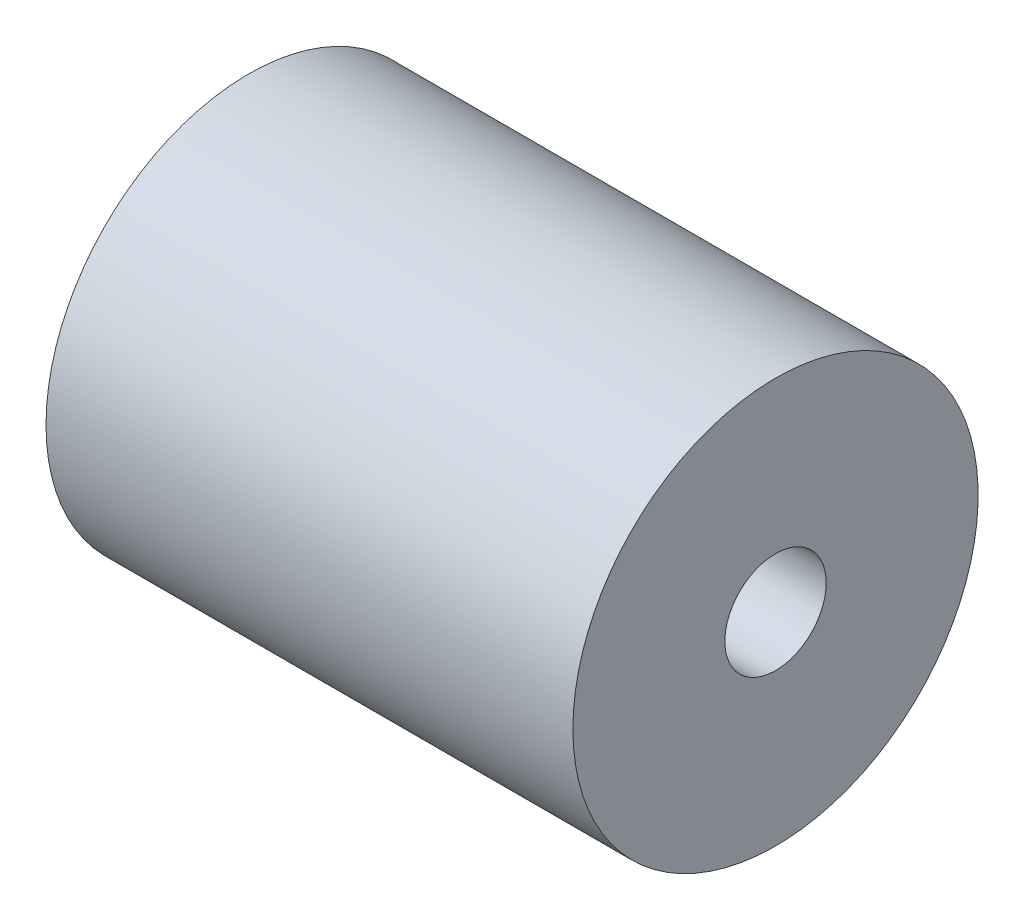
ISO-10303-21;
HEADER;
FILE_DESCRIPTION(('STEP AP214'),'2;1');
FILE_NAME('part.step','',(''),(''),'','','');
FILE_SCHEMA(('AUTOMOTIVE_DESIGN { 1 0 10303 214 1 1 1 1 }'));
ENDSEC;
DATA;
#1=APPLICATION_CONTEXT('core data for automotive mechanical design processes');
#2=APPLICATION_PROTOCOL_DEFINITION('international standard','automotive_design',2000,#1);
#3=PRODUCT_CONTEXT('',#1,'mechanical');
#4=PRODUCT('Part','Part','',(#3));
#5=PRODUCT_RELATED_PRODUCT_CATEGORY('part','',(#4));
#6=PRODUCT_DEFINITION_FORMATION('','',#4);
#7=PRODUCT_DEFINITION_CONTEXT('part definition',#1,'design');
#8=PRODUCT_DEFINITION('design','',#6,#7);
#9=PRODUCT_DEFINITION_SHAPE('','',#8);
#10=(LENGTH_UNIT() NAMED_UNIT(*) SI_UNIT(.MILLI.,.METRE.));
#11=(NAMED_UNIT(*) PLANE_ANGLE_UNIT() SI_UNIT($,.RADIAN.));
#12=(NAMED_UNIT(*) SI_UNIT($,.STERADIAN.) SOLID_ANGLE_UNIT());
#13=UNCERTAINTY_MEASURE_WITH_UNIT(LENGTH_MEASURE(1.E-05),#10,'distance_accuracy_value','');
#14=(GEOMETRIC_REPRESENTATION_CONTEXT(3) GLOBAL_UNCERTAINTY_ASSIGNED_CONTEXT((#13)) GLOBAL_UNIT_ASSIGNED_CONTEXT((#10,
#11,#12)) REPRESENTATION_CONTEXT('',''));
#15=CARTESIAN_POINT('',(0.,0.,0.));
#16=DIRECTION('',(0.,0.,1.));
#17=DIRECTION('',(1.,0.,0.));
#18=AXIS2_PLACEMENT_3D('',#15,#16,#17);
#19=CARTESIAN_POINT('',(13.,0.,0.));
#20=DIRECTION('',(-1.,0.,0.));
#21=DIRECTION('',(0.,0.,1.));
#22=AXIS2_PLACEMENT_3D('',#19,#20,#21);
#23=CYLINDRICAL_SURFACE('',#22,10.);
#24=CARTESIAN_POINT('',(13.,0.,0.));
#25=DIRECTION('',(1.,0.,0.));
#26=DIRECTION('',(0.,0.,-1.));
#27=AXIS2_PLACEMENT_3D('',#24,#25,#26);
#28=CIRCLE('',#27,10.);
#29=CARTESIAN_POINT('',(13.,0.,10.));
#30=VERTEX_POINT('',#29);
#31=EDGE_CURVE('E10',#30,#30,#28,.T.);
#32=CARTESIAN_POINT('',(-13.,0.,0.));
#33=DIRECTION('',(1.,0.,0.));
#34=DIRECTION('',(0.,0.,-1.));
#35=AXIS2_PLACEMENT_3D('',#32,#33,#34);
#36=CIRCLE('',#35,10.);
#37=CARTESIAN_POINT('',(-13.,0.,10.));
#38=VERTEX_POINT('',#37);
#39=EDGE_CURVE('E34',#38,#38,#36,.T.);
#40=CARTESIAN_POINT('',(13.,0.,10.));
#41=CARTESIAN_POINT('',(12.7291666666667,0.,10.));
#42=CARTESIAN_POINT('',(12.4583333333333,0.,10.));
#43=CARTESIAN_POINT('',(11.9166666666667,0.,10.));
#44=CARTESIAN_POINT('',(11.6458333333333,0.,10.));
#45=CARTESIAN_POINT('',(11.1041666666667,0.,10.));
#46=CARTESIAN_POINT('',(10.8333333333333,0.,10.));
#47=CARTESIAN_POINT('',(10.2916666666667,0.,10.));
#48=CARTESIAN_POINT('',(10.0208333333333,0.,10.));
#49=CARTESIAN_POINT('',(9.47916666666667,0.,10.));
#50=CARTESIAN_POINT('',(9.20833333333333,0.,10.));
#51=CARTESIAN_POINT('',(8.66666666666667,0.,10.));
#52=CARTESIAN_POINT('',(8.39583333333333,0.,10.));
#53=CARTESIAN_POINT('',(7.85416666666667,0.,10.));
#54=CARTESIAN_POINT('',(7.58333333333333,0.,10.));
#55=CARTESIAN_POINT('',(7.04166666666667,0.,10.));
#56=CARTESIAN_POINT('',(6.77083333333333,0.,10.));
#57=CARTESIAN_POINT('',(6.22916666666667,0.,10.));
#58=CARTESIAN_POINT('',(5.95833333333333,0.,10.));
#59=CARTESIAN_POINT('',(5.41666666666667,0.,10.));
#60=CARTESIAN_POINT('',(5.14583333333333,0.,10.));
#61=CARTESIAN_POINT('',(4.60416666666667,0.,10.));
#62=CARTESIAN_POINT('',(4.33333333333333,0.,10.));
#63=CARTESIAN_POINT('',(3.79166666666667,0.,10.));
#64=CARTESIAN_POINT('',(3.52083333333333,0.,10.));
#65=CARTESIAN_POINT('',(2.97916666666666,0.,10.));
#66=CARTESIAN_POINT('',(2.70833333333333,0.,10.));
#67=CARTESIAN_POINT('',(2.16666666666667,0.,10.));
#68=CARTESIAN_POINT('',(1.89583333333333,0.,10.));
#69=CARTESIAN_POINT('',(1.35416666666666,0.,10.));
#70=CARTESIAN_POINT('',(1.08333333333333,0.,10.));
#71=CARTESIAN_POINT('',(0.541666666666665,0.,10.));
#72=CARTESIAN_POINT('',(0.270833333333332,0.,10.));
#73=CARTESIAN_POINT('',(-0.270833333333335,0.,10.));
#74=CARTESIAN_POINT('',(-0.541666666666669,0.,10.));
#75=CARTESIAN_POINT('',(-1.08333333333334,0.,10.));
#76=CARTESIAN_POINT('',(-1.35416666666667,0.,10.));
#77=CARTESIAN_POINT('',(-1.89583333333333,0.,10.));
#78=CARTESIAN_POINT('',(-2.16666666666667,0.,10.));
#79=CARTESIAN_POINT('',(-2.70833333333333,0.,10.));
#80=CARTESIAN_POINT('',(-2.97916666666667,0.,10.));
#81=CARTESIAN_POINT('',(-3.52083333333333,0.,10.));
#82=CARTESIAN_POINT('',(-3.79166666666667,0.,10.));
#83=CARTESIAN_POINT('',(-4.33333333333333,0.,10.));
#84=CARTESIAN_POINT('',(-4.60416666666667,0.,10.));
#85=CARTESIAN_POINT('',(-5.14583333333333,0.,10.));
#86=CARTESIAN_POINT('',(-5.41666666666667,0.,10.));
#87=CARTESIAN_POINT('',(-5.95833333333333,0.,10.));
#88=CARTESIAN_POINT('',(-6.22916666666667,0.,10.));
#89=CARTESIAN_POINT('',(-6.77083333333333,0.,10.));
#90=CARTESIAN_POINT('',(-7.04166666666667,0.,10.));
#91=CARTESIAN_POINT('',(-7.58333333333333,0.,10.));
#92=CARTESIAN_POINT('',(-7.85416666666667,0.,10.));
#93=CARTESIAN_POINT('',(-8.39583333333333,0.,10.));
#94=CARTESIAN_POINT('',(-8.66666666666667,0.,10.));
#95=CARTESIAN_POINT('',(-9.20833333333333,0.,10.));
#96=CARTESIAN_POINT('',(-9.47916666666667,0.,10.));
#97=CARTESIAN_POINT('',(-10.0208333333333,0.,10.));
#98=CARTESIAN_POINT('',(-10.2916666666667,0.,10.));
#99=CARTESIAN_POINT('',(-10.8333333333333,0.,10.));
#100=CARTESIAN_POINT('',(-11.1041666666667,0.,10.));
#101=CARTESIAN_POINT('',(-11.6458333333333,0.,10.));
#102=CARTESIAN_POINT('',(-11.9166666666667,0.,10.));
#103=CARTESIAN_POINT('',(-12.4583333333333,0.,10.));
#104=CARTESIAN_POINT('',(-12.7291666666667,0.,10.));
#105=CARTESIAN_POINT('',(-13.,0.,10.));
#106=B_SPLINE_CURVE_WITH_KNOTS('',3,(#40,#41,#42,#43,#44,#45,#46,#47,#48,#49,#50,#51,#52,#53,
#54,#55,#56,#57,#58,#59,#60,#61,#62,#63,#64,#65,#66,#67,#68,#69,#70,#71,#72,#73,#74,#75,#76,#77,
#78,#79,#80,#81,#82,#83,#84,#85,#86,#87,#88,#89,#90,#91,#92,#93,#94,#95,#96,#97,#98,#99,#100,
#101,#102,#103,#104,#105),.UNSPECIFIED.,.F.,.F.,(4,2,2,2,2,2,2,2,2,2,2,2,2,2,2,2,2,2,2,2,2,2,2,
2,2,2,2,2,2,2,2,2,4),(0.,0.812499999999999,1.625,2.4375,3.25,4.0625,4.875,5.6875,6.5,7.3125,
8.125,8.9375,9.75,10.5625,11.375,12.1875,13.,13.8125,14.625,15.4375,16.25,17.0625,17.875,
18.6875,19.5,20.3125,21.125,21.9375,22.75,23.5625,24.375,25.1875,26.),.UNSPECIFIED.);
#107=EDGE_CURVE('BSEAM31',#30,#38,#106,.T.);
#108=ORIENTED_EDGE('',*,*,#31,.F.);
#109=ORIENTED_EDGE('',*,*,#39,.T.);
#110=ORIENTED_EDGE('',*,*,#107,.T.);
#111=ORIENTED_EDGE('',*,*,#107,.F.);
#112=EDGE_LOOP('',(#108,#110,#109,#111));
#113=FACE_BOUND('',#112,.T.);
#114=ADVANCED_FACE('F31',(#113),#23,.T.);
#115=CARTESIAN_POINT('',(13.,0.,0.));
#116=DIRECTION('',(1.,0.,0.));
#117=DIRECTION('',(0.,0.,-1.));
#118=AXIS2_PLACEMENT_3D('',#115,#116,#117);
#119=PLANE('',#118);
#120=CARTESIAN_POINT('',(13.,0.,0.));
#121=DIRECTION('',(1.,0.,0.));
#122=DIRECTION('',(0.,0.,-1.));
#123=AXIS2_PLACEMENT_3D('',#120,#121,#122);
#124=CIRCLE('',#123,2.5);
#125=CARTESIAN_POINT('',(13.,0.,-2.5));
#126=VERTEX_POINT('',#125);
#127=EDGE_CURVE('E41',#126,#126,#124,.T.);
#128=ORIENTED_EDGE('',*,*,#127,.F.);
#129=EDGE_LOOP('',(#128));
#130=FACE_BOUND('',#129,.T.);
#131=ORIENTED_EDGE('',*,*,#31,.T.);
#132=EDGE_LOOP('',(#131));
#133=FACE_BOUND('',#132,.T.);
#134=ADVANCED_FACE('F68',(#130,#133),#119,.T.);
#135=CARTESIAN_POINT('',(-13.,0.,0.));
#136=DIRECTION('',(1.,0.,0.));
#137=DIRECTION('',(0.,0.,-1.));
#138=AXIS2_PLACEMENT_3D('',#135,#136,#137);
#139=PLANE('',#138);
#140=CARTESIAN_POINT('',(-13.,0.,0.));
#141=DIRECTION('',(-1.,0.,0.));
#142=DIRECTION('',(0.,0.,1.));
#143=AXIS2_PLACEMENT_3D('',#140,#141,#142);
#144=CIRCLE('',#143,4.);
#145=CARTESIAN_POINT('',(-13.,0.,4.));
#146=VERTEX_POINT('',#145);
#147=EDGE_CURVE('E49',#146,#146,#144,.T.);
#148=ORIENTED_EDGE('',*,*,#147,.F.);
#149=EDGE_LOOP('',(#148));
#150=FACE_BOUND('',#149,.T.);
#151=ORIENTED_EDGE('',*,*,#39,.F.);
#152=EDGE_LOOP('',(#151));
#153=FACE_BOUND('',#152,.T.);
#154=ADVANCED_FACE('F64',(#150,#153),#139,.F.);
#155=CARTESIAN_POINT('',(0.,0.,0.));
#156=DIRECTION('',(1.,0.,0.));
#157=DIRECTION('',(0.,0.,-1.));
#158=AXIS2_PLACEMENT_3D('',#155,#156,#157);
#159=CYLINDRICAL_SURFACE('',#158,2.5);
#160=CARTESIAN_POINT('',(0.,0.,0.));
#161=DIRECTION('',(1.,0.,0.));
#162=DIRECTION('',(0.,0.,-1.));
#163=AXIS2_PLACEMENT_3D('',#160,#161,#162);
#164=CIRCLE('',#163,2.5);
#165=CARTESIAN_POINT('',(0.,0.,-2.5));
#166=VERTEX_POINT('',#165);
#167=EDGE_CURVE('E45',#166,#166,#164,.T.);
#168=CARTESIAN_POINT('',(0.,0.,-2.5));
#169=CARTESIAN_POINT('',(0.135416666666666,0.,-2.5));
#170=CARTESIAN_POINT('',(0.270833333333333,0.,-2.5));
#171=CARTESIAN_POINT('',(0.541666666666667,0.,-2.5));
#172=CARTESIAN_POINT('',(0.677083333333333,0.,-2.5));
#173=CARTESIAN_POINT('',(0.947916666666667,0.,-2.5));
#174=CARTESIAN_POINT('',(1.08333333333333,0.,-2.5));
#175=CARTESIAN_POINT('',(1.35416666666667,0.,-2.5));
#176=CARTESIAN_POINT('',(1.48958333333333,0.,-2.5));
#177=CARTESIAN_POINT('',(1.76041666666667,0.,-2.5));
#178=CARTESIAN_POINT('',(1.89583333333333,0.,-2.5));
#179=CARTESIAN_POINT('',(2.16666666666667,0.,-2.5));
#180=CARTESIAN_POINT('',(2.30208333333333,0.,-2.5));
#181=CARTESIAN_POINT('',(2.57291666666667,0.,-2.5));
#182=CARTESIAN_POINT('',(2.70833333333333,0.,-2.5));
#183=CARTESIAN_POINT('',(2.97916666666667,0.,-2.5));
#184=CARTESIAN_POINT('',(3.11458333333333,0.,-2.5));
#185=CARTESIAN_POINT('',(3.38541666666667,0.,-2.5));
#186=CARTESIAN_POINT('',(3.52083333333333,0.,-2.5));
#187=CARTESIAN_POINT('',(3.79166666666667,0.,-2.5));
#188=CARTESIAN_POINT('',(3.92708333333333,0.,-2.5));
#189=CARTESIAN_POINT('',(4.19791666666667,0.,-2.5));
#190=CARTESIAN_POINT('',(4.33333333333333,0.,-2.5));
#191=CARTESIAN_POINT('',(4.60416666666667,0.,-2.5));
#192=CARTESIAN_POINT('',(4.73958333333333,0.,-2.5));
#193=CARTESIAN_POINT('',(5.01041666666667,0.,-2.5));
#194=CARTESIAN_POINT('',(5.14583333333333,0.,-2.5));
#195=CARTESIAN_POINT('',(5.41666666666667,0.,-2.5));
#196=CARTESIAN_POINT('',(5.55208333333333,0.,-2.5));
#197=CARTESIAN_POINT('',(5.82291666666667,0.,-2.5));
#198=CARTESIAN_POINT('',(5.95833333333333,0.,-2.5));
#199=CARTESIAN_POINT('',(6.22916666666667,0.,-2.5));
#200=CARTESIAN_POINT('',(6.36458333333333,0.,-2.5));
#201=CARTESIAN_POINT('',(6.63541666666667,0.,-2.5));
#202=CARTESIAN_POINT('',(6.77083333333333,0.,-2.5));
#203=CARTESIAN_POINT('',(7.04166666666667,0.,-2.5));
#204=CARTESIAN_POINT('',(7.17708333333333,0.,-2.5));
#205=CARTESIAN_POINT('',(7.44791666666667,0.,-2.5));
#206=CARTESIAN_POINT('',(7.58333333333333,0.,-2.5));
#207=CARTESIAN_POINT('',(7.85416666666667,0.,-2.5));
#208=CARTESIAN_POINT('',(7.98958333333333,0.,-2.5));
#209=CARTESIAN_POINT('',(8.26041666666667,0.,-2.5));
#210=CARTESIAN_POINT('',(8.39583333333333,0.,-2.5));
#211=CARTESIAN_POINT('',(8.66666666666667,0.,-2.5));
#212=CARTESIAN_POINT('',(8.80208333333333,0.,-2.5));
#213=CARTESIAN_POINT('',(9.07291666666667,0.,-2.5));
#214=CARTESIAN_POINT('',(9.20833333333333,0.,-2.5));
#215=CARTESIAN_POINT('',(9.47916666666667,0.,-2.5));
#216=CARTESIAN_POINT('',(9.61458333333333,0.,-2.5));
#217=CARTESIAN_POINT('',(9.88541666666667,0.,-2.5));
#218=CARTESIAN_POINT('',(10.0208333333333,0.,-2.5));
#219=CARTESIAN_POINT('',(10.2916666666667,0.,-2.5));
#220=CARTESIAN_POINT('',(10.4270833333333,0.,-2.5));
#221=CARTESIAN_POINT('',(10.6979166666667,0.,-2.5));
#222=CARTESIAN_POINT('',(10.8333333333333,0.,-2.5));
#223=CARTESIAN_POINT('',(11.1041666666667,0.,-2.5));
#224=CARTESIAN_POINT('',(11.2395833333333,0.,-2.5));
#225=CARTESIAN_POINT('',(11.5104166666667,0.,-2.5));
#226=CARTESIAN_POINT('',(11.6458333333333,0.,-2.5));
#227=CARTESIAN_POINT('',(11.9166666666667,0.,-2.5));
#228=CARTESIAN_POINT('',(12.0520833333333,0.,-2.5));
#229=CARTESIAN_POINT('',(12.3229166666667,0.,-2.5));
#230=CARTESIAN_POINT('',(12.4583333333333,0.,-2.5));
#231=CARTESIAN_POINT('',(12.7291666666667,0.,-2.5));
#232=CARTESIAN_POINT('',(12.8645833333333,0.,-2.5));
#233=CARTESIAN_POINT('',(13.,0.,-2.5));
#234=B_SPLINE_CURVE_WITH_KNOTS('',3,(#168,#169,#170,#171,#172,#173,#174,#175,#176,#177,#178,
#179,#180,#181,#182,#183,#184,#185,#186,#187,#188,#189,#190,#191,#192,#193,#194,#195,#196,#197,
#198,#199,#200,#201,#202,#203,#204,#205,#206,#207,#208,#209,#210,#211,#212,#213,#214,#215,#216,
#217,#218,#219,#220,#221,#222,#223,#224,#225,#226,#227,#228,#229,#230,#231,#232,#233),
.UNSPECIFIED.,.F.,.F.,(4,2,2,2,2,2,2,2,2,2,2,2,2,2,2,2,2,2,2,2,2,2,2,2,2,2,2,2,2,2,2,2,4),(0.,
0.40625,0.8125,1.21875,1.625,2.03125,2.4375,2.84375,3.25,3.65625,4.0625,4.46875,4.875,5.28125,
5.6875,6.09375,6.5,6.90625,7.3125,7.71875,8.125,8.53125,8.9375,9.34375,9.75,10.15625,10.5625,
10.96875,11.375,11.78125,12.1875,12.59375,13.),.UNSPECIFIED.);
#235=EDGE_CURVE('BSEAM67',#166,#126,#234,.T.);
#236=ORIENTED_EDGE('',*,*,#167,.F.);
#237=ORIENTED_EDGE('',*,*,#127,.T.);
#238=ORIENTED_EDGE('',*,*,#235,.T.);
#239=ORIENTED_EDGE('',*,*,#235,.F.);
#240=EDGE_LOOP('',(#236,#238,#237,#239));
#241=FACE_BOUND('',#240,.T.);
#242=ADVANCED_FACE('F67',(#241),#159,.F.);
#243=CARTESIAN_POINT('',(0.,0.,0.));
#244=DIRECTION('',(-1.,0.,0.));
#245=DIRECTION('',(0.,0.,1.));
#246=AXIS2_PLACEMENT_3D('',#243,#244,#245);
#247=PLANE('',#246);
#248=CARTESIAN_POINT('',(0.,0.,0.));
#249=DIRECTION('',(-1.,0.,0.));
#250=DIRECTION('',(0.,0.,1.));
#251=AXIS2_PLACEMENT_3D('',#248,#249,#250);
#252=CIRCLE('',#251,4.);
#253=CARTESIAN_POINT('',(0.,0.,4.));
#254=VERTEX_POINT('',#253);
#255=EDGE_CURVE('E48',#254,#254,#252,.T.);
#256=ORIENTED_EDGE('',*,*,#255,.T.);
#257=EDGE_LOOP('',(#256));
#258=FACE_BOUND('',#257,.T.);
#259=ORIENTED_EDGE('',*,*,#167,.T.);
#260=EDGE_LOOP('',(#259));
#261=FACE_BOUND('',#260,.T.);
#262=ADVANCED_FACE('F55',(#258,#261),#247,.T.);
#263=CARTESIAN_POINT('',(0.,0.,0.));
#264=DIRECTION('',(-1.,0.,0.));
#265=DIRECTION('',(0.,0.,1.));
#266=AXIS2_PLACEMENT_3D('',#263,#264,#265);
#267=CYLINDRICAL_SURFACE('',#266,4.);
#268=CARTESIAN_POINT('',(0.,0.,4.));
#269=CARTESIAN_POINT('',(-0.135416666666666,0.,4.));
#270=CARTESIAN_POINT('',(-0.270833333333333,0.,4.));
#271=CARTESIAN_POINT('',(-0.541666666666667,0.,4.));
#272=CARTESIAN_POINT('',(-0.677083333333333,0.,4.));
#273=CARTESIAN_POINT('',(-0.947916666666667,0.,4.));
#274=CARTESIAN_POINT('',(-1.08333333333333,0.,4.));
#275=CARTESIAN_POINT('',(-1.35416666666667,0.,4.));
#276=CARTESIAN_POINT('',(-1.48958333333333,0.,4.));
#277=CARTESIAN_POINT('',(-1.76041666666667,0.,4.));
#278=CARTESIAN_POINT('',(-1.89583333333333,0.,4.));
#279=CARTESIAN_POINT('',(-2.16666666666667,0.,4.));
#280=CARTESIAN_POINT('',(-2.30208333333333,0.,4.));
#281=CARTESIAN_POINT('',(-2.57291666666667,0.,4.));
#282=CARTESIAN_POINT('',(-2.70833333333333,0.,4.));
#283=CARTESIAN_POINT('',(-2.97916666666667,0.,4.));
#284=CARTESIAN_POINT('',(-3.11458333333333,0.,4.));
#285=CARTESIAN_POINT('',(-3.38541666666667,0.,4.));
#286=CARTESIAN_POINT('',(-3.52083333333333,0.,4.));
#287=CARTESIAN_POINT('',(-3.79166666666667,0.,4.));
#288=CARTESIAN_POINT('',(-3.92708333333333,0.,4.));
#289=CARTESIAN_POINT('',(-4.19791666666667,0.,4.));
#290=CARTESIAN_POINT('',(-4.33333333333333,0.,4.));
#291=CARTESIAN_POINT('',(-4.60416666666667,0.,4.));
#292=CARTESIAN_POINT('',(-4.73958333333333,0.,4.));
#293=CARTESIAN_POINT('',(-5.01041666666667,0.,4.));
#294=CARTESIAN_POINT('',(-5.14583333333333,0.,4.));
#295=CARTESIAN_POINT('',(-5.41666666666667,0.,4.));
#296=CARTESIAN_POINT('',(-5.55208333333333,0.,4.));
#297=CARTESIAN_POINT('',(-5.82291666666667,0.,4.));
#298=CARTESIAN_POINT('',(-5.95833333333333,0.,4.));
#299=CARTESIAN_POINT('',(-6.22916666666667,0.,4.));
#300=CARTESIAN_POINT('',(-6.36458333333333,0.,4.));
#301=CARTESIAN_POINT('',(-6.63541666666667,0.,4.));
#302=CARTESIAN_POINT('',(-6.77083333333333,0.,4.));
#303=CARTESIAN_POINT('',(-7.04166666666667,0.,4.));
#304=CARTESIAN_POINT('',(-7.17708333333333,0.,4.));
#305=CARTESIAN_POINT('',(-7.44791666666667,0.,4.));
#306=CARTESIAN_POINT('',(-7.58333333333333,0.,4.));
#307=CARTESIAN_POINT('',(-7.85416666666667,0.,4.));
#308=CARTESIAN_POINT('',(-7.98958333333333,0.,4.));
#309=CARTESIAN_POINT('',(-8.26041666666667,0.,4.));
#310=CARTESIAN_POINT('',(-8.39583333333333,0.,4.));
#311=CARTESIAN_POINT('',(-8.66666666666667,0.,4.));
#312=CARTESIAN_POINT('',(-8.80208333333333,0.,4.));
#313=CARTESIAN_POINT('',(-9.07291666666667,0.,4.));
#314=CARTESIAN_POINT('',(-9.20833333333333,0.,4.));
#315=CARTESIAN_POINT('',(-9.47916666666667,0.,4.));
#316=CARTESIAN_POINT('',(-9.61458333333333,0.,4.));
#317=CARTESIAN_POINT('',(-9.88541666666667,0.,4.));
#318=CARTESIAN_POINT('',(-10.0208333333333,0.,4.));
#319=CARTESIAN_POINT('',(-10.2916666666667,0.,4.));
#320=CARTESIAN_POINT('',(-10.4270833333333,0.,4.));
#321=CARTESIAN_POINT('',(-10.6979166666667,0.,4.));
#322=CARTESIAN_POINT('',(-10.8333333333333,0.,4.));
#323=CARTESIAN_POINT('',(-11.1041666666667,0.,4.));
#324=CARTESIAN_POINT('',(-11.2395833333333,0.,4.));
#325=CARTESIAN_POINT('',(-11.5104166666667,0.,4.));
#326=CARTESIAN_POINT('',(-11.6458333333333,0.,4.));
#327=CARTESIAN_POINT('',(-11.9166666666667,0.,4.));
#328=CARTESIAN_POINT('',(-12.0520833333333,0.,4.));
#329=CARTESIAN_POINT('',(-12.3229166666667,0.,4.));
#330=CARTESIAN_POINT('',(-12.4583333333333,0.,4.));
#331=CARTESIAN_POINT('',(-12.7291666666667,0.,4.));
#332=CARTESIAN_POINT('',(-12.8645833333333,0.,4.));
#333=CARTESIAN_POINT('',(-13.,0.,4.));
#334=B_SPLINE_CURVE_WITH_KNOTS('',3,(#268,#269,#270,#271,#272,#273,#274,#275,#276,#277,#278,
#279,#280,#281,#282,#283,#284,#285,#286,#287,#288,#289,#290,#291,#292,#293,#294,#295,#296,#297,
#298,#299,#300,#301,#302,#303,#304,#305,#306,#307,#308,#309,#310,#311,#312,#313,#314,#315,#316,
#317,#318,#319,#320,#321,#322,#323,#324,#325,#326,#327,#328,#329,#330,#331,#332,#333),
.UNSPECIFIED.,.F.,.F.,(4,2,2,2,2,2,2,2,2,2,2,2,2,2,2,2,2,2,2,2,2,2,2,2,2,2,2,2,2,2,2,2,4),(0.,
0.40625,0.8125,1.21875,1.625,2.03125,2.4375,2.84375,3.25,3.65625,4.0625,4.46875,4.875,5.28125,
5.6875,6.09375,6.5,6.90625,7.3125,7.71875,8.125,8.53125,8.9375,9.34375,9.75,10.15625,10.5625,
10.96875,11.375,11.78125,12.1875,12.59375,13.),.UNSPECIFIED.);
#335=EDGE_CURVE('BSEAM58',#254,#146,#334,.T.);
#336=ORIENTED_EDGE('',*,*,#255,.F.);
#337=ORIENTED_EDGE('',*,*,#147,.T.);
#338=ORIENTED_EDGE('',*,*,#335,.T.);
#339=ORIENTED_EDGE('',*,*,#335,.F.);
#340=EDGE_LOOP('',(#336,#338,#337,#339));
#341=FACE_BOUND('',#340,.T.);
#342=ADVANCED_FACE('F58',(#341),#267,.F.);
#343=CLOSED_SHELL('',(#114,#134,#154,#242,#262,#342));
#344=MANIFOLD_SOLID_BREP('B2',#343);
#345=ADVANCED_BREP_SHAPE_REPRESENTATION('',(#18,#344),#14);
#346=SHAPE_DEFINITION_REPRESENTATION(#9,#345);
ENDSEC;
END-ISO-10303-21;
